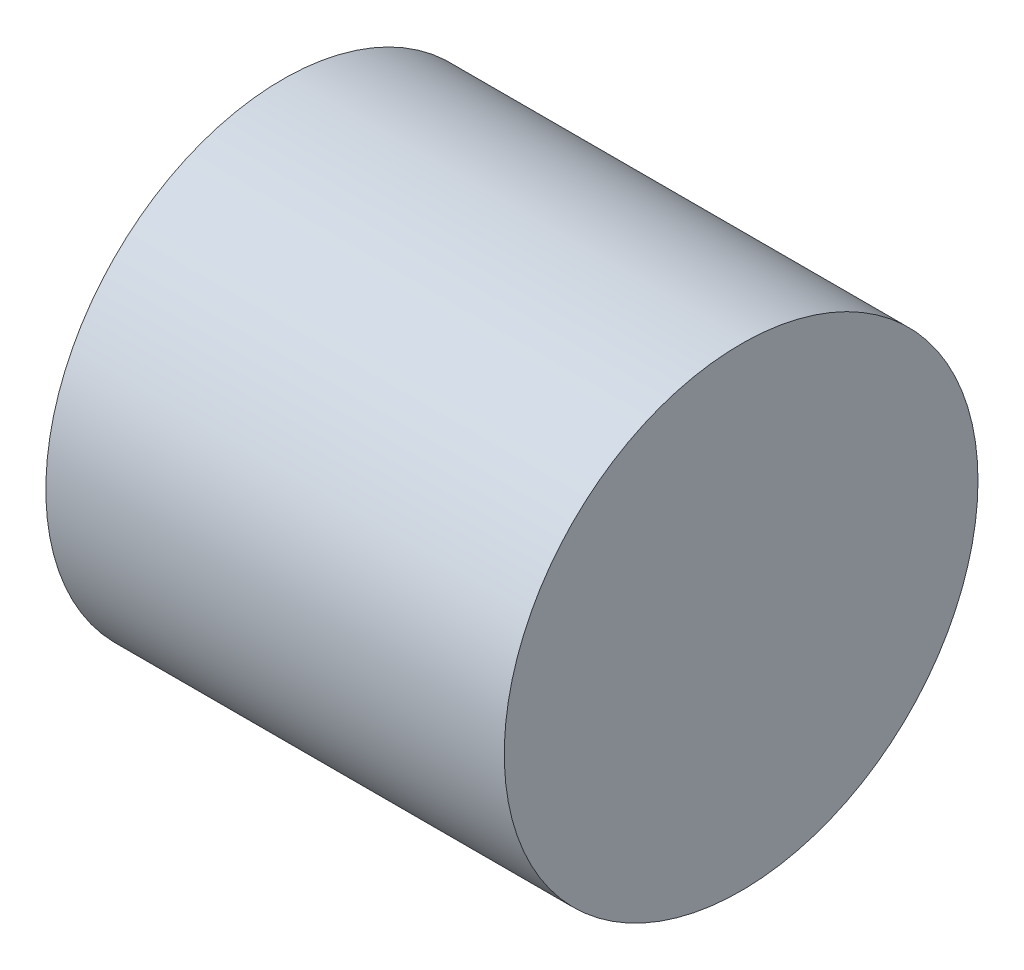
ISO-10303-21;
HEADER;
FILE_DESCRIPTION(('STEP AP214'),'2;1');
FILE_NAME('part.step','',(''),(''),'','','');
FILE_SCHEMA(('AUTOMOTIVE_DESIGN { 1 0 10303 214 1 1 1 1 }'));
ENDSEC;
DATA;
#1=APPLICATION_CONTEXT('core data for automotive mechanical design processes');
#2=APPLICATION_PROTOCOL_DEFINITION('international standard','automotive_design',2000,#1);
#3=PRODUCT_CONTEXT('',#1,'mechanical');
#4=PRODUCT('Part','Part','',(#3));
#5=PRODUCT_RELATED_PRODUCT_CATEGORY('part','',(#4));
#6=PRODUCT_DEFINITION_FORMATION('','',#4);
#7=PRODUCT_DEFINITION_CONTEXT('part definition',#1,'design');
#8=PRODUCT_DEFINITION('design','',#6,#7);
#9=PRODUCT_DEFINITION_SHAPE('','',#8);
#10=(LENGTH_UNIT() NAMED_UNIT(*) SI_UNIT(.MILLI.,.METRE.));
#11=(NAMED_UNIT(*) PLANE_ANGLE_UNIT() SI_UNIT($,.RADIAN.));
#12=(NAMED_UNIT(*) SI_UNIT($,.STERADIAN.) SOLID_ANGLE_UNIT());
#13=UNCERTAINTY_MEASURE_WITH_UNIT(LENGTH_MEASURE(1.E-05),#10,'distance_accuracy_value','');
#14=(GEOMETRIC_REPRESENTATION_CONTEXT(3) GLOBAL_UNCERTAINTY_ASSIGNED_CONTEXT((#13)) GLOBAL_UNIT_ASSIGNED_CONTEXT((#10,
#11,#12)) REPRESENTATION_CONTEXT('',''));
#15=CARTESIAN_POINT('',(0.,0.,0.));
#16=DIRECTION('',(0.,0.,1.));
#17=DIRECTION('',(1.,0.,0.));
#18=AXIS2_PLACEMENT_3D('',#15,#16,#17);
#19=CARTESIAN_POINT('',(13.193,-5.983,-3.719));
#20=DIRECTION('',(-1.,0.,0.));
#21=DIRECTION('',(0.,0.,1.));
#22=AXIS2_PLACEMENT_3D('',#19,#20,#21);
#23=CYLINDRICAL_SURFACE('',#22,6.817);
#24=CARTESIAN_POINT('',(13.193,-5.983,-3.719));
#25=DIRECTION('',(1.,0.,0.));
#26=DIRECTION('',(0.,0.,-1.));
#27=AXIS2_PLACEMENT_3D('',#24,#25,#26);
#28=CIRCLE('',#27,6.817);
#29=CARTESIAN_POINT('',(13.193,-5.983,-10.536));
#30=VERTEX_POINT('',#29);
#31=EDGE_CURVE('E10',#30,#30,#28,.T.);
#32=ORIENTED_EDGE('',*,*,#31,.F.);
#33=EDGE_LOOP('',(#32));
#34=FACE_BOUND('',#33,.T.);
#35=CARTESIAN_POINT('',(0.,-5.983,-3.719));
#36=DIRECTION('',(1.,0.,0.));
#37=DIRECTION('',(0.,0.,-1.));
#38=AXIS2_PLACEMENT_3D('',#35,#36,#37);
#39=CIRCLE('',#38,6.817);
#40=CARTESIAN_POINT('',(0.,-5.983,-10.536));
#41=VERTEX_POINT('',#40);
#42=EDGE_CURVE('E45',#41,#41,#39,.T.);
#43=ORIENTED_EDGE('',*,*,#42,.T.);
#44=EDGE_LOOP('',(#43));
#45=FACE_BOUND('',#44,.T.);
#46=ADVANCED_FACE('F39',(#34,#45),#23,.T.);
#47=CARTESIAN_POINT('',(13.193,-5.983,-3.719));
#48=DIRECTION('',(1.,0.,0.));
#49=DIRECTION('',(0.,0.,-1.));
#50=AXIS2_PLACEMENT_3D('',#47,#48,#49);
#51=PLANE('',#50);
#52=ORIENTED_EDGE('',*,*,#31,.T.);
#53=EDGE_LOOP('',(#52));
#54=FACE_BOUND('',#53,.T.);
#55=ADVANCED_FACE('F53',(#54),#51,.T.);
#56=CARTESIAN_POINT('',(0.,-5.983,-3.719));
#57=DIRECTION('',(1.,0.,0.));
#58=DIRECTION('',(0.,0.,-1.));
#59=AXIS2_PLACEMENT_3D('',#56,#57,#58);
#60=PLANE('',#59);
#61=ORIENTED_EDGE('',*,*,#42,.F.);
#62=EDGE_LOOP('',(#61));
#63=FACE_BOUND('',#62,.T.);
#64=ADVANCED_FACE('F55',(#63),#60,.F.);
#65=CLOSED_SHELL('',(#46,#55,#64));
#66=MANIFOLD_SOLID_BREP('B2',#65);
#67=ADVANCED_BREP_SHAPE_REPRESENTATION('',(#18,#66),#14);
#68=SHAPE_DEFINITION_REPRESENTATION(#9,#67);
ENDSEC;
END-ISO-10303-21;
